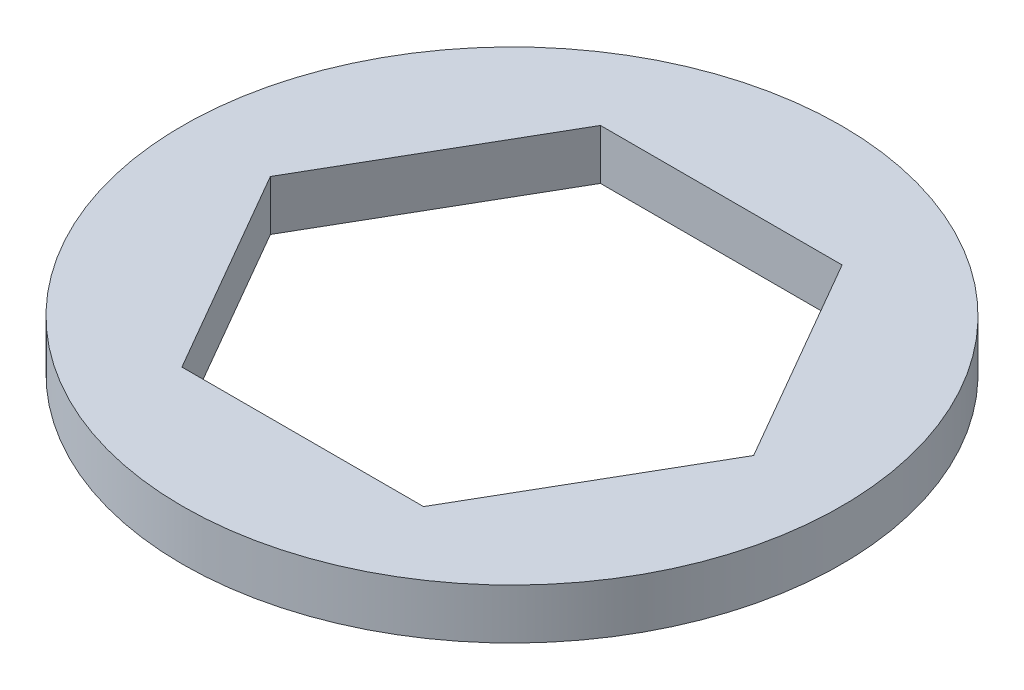
ISO-10303-21;
HEADER;
FILE_DESCRIPTION(('STEP AP214'),'2;1');
FILE_NAME('part.step','',(''),(''),'','','');
FILE_SCHEMA(('AUTOMOTIVE_DESIGN { 1 0 10303 214 1 1 1 1 }'));
ENDSEC;
DATA;
#1=APPLICATION_CONTEXT('core data for automotive mechanical design processes');
#2=APPLICATION_PROTOCOL_DEFINITION('international standard','automotive_design',2000,#1);
#3=PRODUCT_CONTEXT('',#1,'mechanical');
#4=PRODUCT('Part','Part','',(#3));
#5=PRODUCT_RELATED_PRODUCT_CATEGORY('part','',(#4));
#6=PRODUCT_DEFINITION_FORMATION('','',#4);
#7=PRODUCT_DEFINITION_CONTEXT('part definition',#1,'design');
#8=PRODUCT_DEFINITION('design','',#6,#7);
#9=PRODUCT_DEFINITION_SHAPE('','',#8);
#10=(LENGTH_UNIT() NAMED_UNIT(*) SI_UNIT(.MILLI.,.METRE.));
#11=(NAMED_UNIT(*) PLANE_ANGLE_UNIT() SI_UNIT($,.RADIAN.));
#12=(NAMED_UNIT(*) SI_UNIT($,.STERADIAN.) SOLID_ANGLE_UNIT());
#13=UNCERTAINTY_MEASURE_WITH_UNIT(LENGTH_MEASURE(1.E-05),#10,'distance_accuracy_value','');
#14=(GEOMETRIC_REPRESENTATION_CONTEXT(3) GLOBAL_UNCERTAINTY_ASSIGNED_CONTEXT((#13)) GLOBAL_UNIT_ASSIGNED_CONTEXT((#10,
#11,#12)) REPRESENTATION_CONTEXT('',''));
#15=CARTESIAN_POINT('',(0.,0.,0.));
#16=DIRECTION('',(0.,0.,1.));
#17=DIRECTION('',(1.,0.,0.));
#18=AXIS2_PLACEMENT_3D('',#15,#16,#17);
#19=CARTESIAN_POINT('',(0.,1.524,0.));
#20=DIRECTION('',(0.,1.,0.));
#21=DIRECTION('',(0.,0.,1.));
#22=AXIS2_PLACEMENT_3D('',#19,#20,#21);
#23=PLANE('',#22);
#24=CARTESIAN_POINT('',(0.,1.524,0.));
#25=DIRECTION('',(0.,1.,0.));
#26=DIRECTION('',(0.,0.,1.));
#27=AXIS2_PLACEMENT_3D('',#24,#25,#26);
#28=CIRCLE('',#27,10.);
#29=CARTESIAN_POINT('',(0.,1.524,-10.));
#30=VERTEX_POINT('',#29);
#31=EDGE_CURVE('E11',#30,#30,#28,.T.);
#32=ORIENTED_EDGE('',*,*,#31,.T.);
#33=EDGE_LOOP('',(#32));
#34=FACE_BOUND('',#33,.T.);
#35=DIRECTION('',(0.5,0.,0.866025403784439));
#36=VECTOR('',#35,1.);
#37=CARTESIAN_POINT('',(-7.33234841870825,1.524,0.));
#38=LINE('',#37,#36);
#39=CARTESIAN_POINT('',(-7.33234841870825,1.524,0.));
#40=VERTEX_POINT('',#39);
#41=CARTESIAN_POINT('',(-3.66617420935413,1.524,6.35));
#42=VERTEX_POINT('',#41);
#43=EDGE_CURVE('E93',#40,#42,#38,.T.);
#44=ORIENTED_EDGE('',*,*,#43,.F.);
#45=DIRECTION('',(-0.5,0.,0.866025403784439));
#46=VECTOR('',#45,1.);
#47=CARTESIAN_POINT('',(-3.66617420935412,1.524,-6.35));
#48=LINE('',#47,#46);
#49=CARTESIAN_POINT('',(-3.66617420935412,1.524,-6.35));
#50=VERTEX_POINT('',#49);
#51=EDGE_CURVE('E85',#50,#40,#48,.T.);
#52=ORIENTED_EDGE('',*,*,#51,.F.);
#53=DIRECTION('',(-1.,0.,0.));
#54=VECTOR('',#53,1.);
#55=CARTESIAN_POINT('',(3.66617420935412,1.524,-6.35));
#56=LINE('',#55,#54);
#57=CARTESIAN_POINT('',(3.66617420935412,1.524,-6.35));
#58=VERTEX_POINT('',#57);
#59=EDGE_CURVE('E113',#58,#50,#56,.T.);
#60=ORIENTED_EDGE('',*,*,#59,.F.);
#61=DIRECTION('',(-0.5,0.,-0.866025403784439));
#62=VECTOR('',#61,1.);
#63=CARTESIAN_POINT('',(7.33234841870825,1.524,0.));
#64=LINE('',#63,#62);
#65=CARTESIAN_POINT('',(7.33234841870825,1.524,0.));
#66=VERTEX_POINT('',#65);
#67=EDGE_CURVE('E111',#66,#58,#64,.T.);
#68=ORIENTED_EDGE('',*,*,#67,.F.);
#69=DIRECTION('',(0.5,0.,-0.866025403784439));
#70=VECTOR('',#69,1.);
#71=CARTESIAN_POINT('',(3.66617420935412,1.524,6.35));
#72=LINE('',#71,#70);
#73=CARTESIAN_POINT('',(3.66617420935412,1.524,6.35));
#74=VERTEX_POINT('',#73);
#75=EDGE_CURVE('E107',#74,#66,#72,.T.);
#76=ORIENTED_EDGE('',*,*,#75,.F.);
#77=DIRECTION('',(1.,0.,0.));
#78=VECTOR('',#77,1.);
#79=CARTESIAN_POINT('',(-3.66617420935413,1.524,6.35));
#80=LINE('',#79,#78);
#81=EDGE_CURVE('E105',#42,#74,#80,.T.);
#82=ORIENTED_EDGE('',*,*,#81,.F.);
#83=EDGE_LOOP('',(#44,#52,#60,#68,#76,#82));
#84=FACE_BOUND('',#83,.T.);
#85=ADVANCED_FACE('F32',(#34,#84),#23,.T.);
#86=CARTESIAN_POINT('',(0.,0.,0.));
#87=DIRECTION('',(0.,1.,0.));
#88=DIRECTION('',(0.,0.,1.));
#89=AXIS2_PLACEMENT_3D('',#86,#87,#88);
#90=PLANE('',#89);
#91=CARTESIAN_POINT('',(0.,0.,0.));
#92=DIRECTION('',(0.,1.,0.));
#93=DIRECTION('',(0.,0.,1.));
#94=AXIS2_PLACEMENT_3D('',#91,#92,#93);
#95=CIRCLE('',#94,10.);
#96=CARTESIAN_POINT('',(0.,0.,-10.));
#97=VERTEX_POINT('',#96);
#98=EDGE_CURVE('E36',#97,#97,#95,.T.);
#99=ORIENTED_EDGE('',*,*,#98,.F.);
#100=EDGE_LOOP('',(#99));
#101=FACE_BOUND('',#100,.T.);
#102=DIRECTION('',(-0.5,0.,0.866025403784439));
#103=VECTOR('',#102,1.);
#104=CARTESIAN_POINT('',(-3.66617420935412,0.,-6.35));
#105=LINE('',#104,#103);
#106=CARTESIAN_POINT('',(-3.66617420935412,0.,-6.35));
#107=VERTEX_POINT('',#106);
#108=CARTESIAN_POINT('',(-7.33234841870825,0.,0.));
#109=VERTEX_POINT('',#108);
#110=EDGE_CURVE('E55',#107,#109,#105,.T.);
#111=ORIENTED_EDGE('',*,*,#110,.T.);
#112=DIRECTION('',(0.5,0.,0.866025403784439));
#113=VECTOR('',#112,1.);
#114=CARTESIAN_POINT('',(-7.33234841870825,0.,0.));
#115=LINE('',#114,#113);
#116=CARTESIAN_POINT('',(-3.66617420935413,0.,6.35));
#117=VERTEX_POINT('',#116);
#118=EDGE_CURVE('E100',#109,#117,#115,.T.);
#119=ORIENTED_EDGE('',*,*,#118,.T.);
#120=DIRECTION('',(1.,0.,0.));
#121=VECTOR('',#120,1.);
#122=CARTESIAN_POINT('',(-3.66617420935413,0.,6.35));
#123=LINE('',#122,#121);
#124=CARTESIAN_POINT('',(3.66617420935412,0.,6.35));
#125=VERTEX_POINT('',#124);
#126=EDGE_CURVE('E117',#117,#125,#123,.T.);
#127=ORIENTED_EDGE('',*,*,#126,.T.);
#128=DIRECTION('',(0.5,0.,-0.866025403784439));
#129=VECTOR('',#128,1.);
#130=CARTESIAN_POINT('',(3.66617420935412,0.,6.35));
#131=LINE('',#130,#129);
#132=CARTESIAN_POINT('',(7.33234841870825,0.,0.));
#133=VERTEX_POINT('',#132);
#134=EDGE_CURVE('E120',#125,#133,#131,.T.);
#135=ORIENTED_EDGE('',*,*,#134,.T.);
#136=DIRECTION('',(-0.5,0.,-0.866025403784439));
#137=VECTOR('',#136,1.);
#138=CARTESIAN_POINT('',(7.33234841870825,0.,0.));
#139=LINE('',#138,#137);
#140=CARTESIAN_POINT('',(3.66617420935412,0.,-6.35));
#141=VERTEX_POINT('',#140);
#142=EDGE_CURVE('E123',#133,#141,#139,.T.);
#143=ORIENTED_EDGE('',*,*,#142,.T.);
#144=DIRECTION('',(-1.,0.,0.));
#145=VECTOR('',#144,1.);
#146=CARTESIAN_POINT('',(3.66617420935412,0.,-6.35));
#147=LINE('',#146,#145);
#148=EDGE_CURVE('E94',#141,#107,#147,.T.);
#149=ORIENTED_EDGE('',*,*,#148,.T.);
#150=EDGE_LOOP('',(#111,#119,#127,#135,#143,#149));
#151=FACE_BOUND('',#150,.T.);
#152=ADVANCED_FACE('F140',(#101,#151),#90,.F.);
#153=CARTESIAN_POINT('',(0.,1.524,0.));
#154=DIRECTION('',(0.,-1.,0.));
#155=DIRECTION('',(0.,0.,-1.));
#156=AXIS2_PLACEMENT_3D('',#153,#154,#155);
#157=CYLINDRICAL_SURFACE('',#156,10.);
#158=CARTESIAN_POINT('',(0.,1.524,-10.));
#159=CARTESIAN_POINT('',(0.,1.508125,-10.));
#160=CARTESIAN_POINT('',(0.,1.49225,-10.));
#161=CARTESIAN_POINT('',(0.,1.4605,-10.));
#162=CARTESIAN_POINT('',(0.,1.444625,-10.));
#163=CARTESIAN_POINT('',(0.,1.412875,-10.));
#164=CARTESIAN_POINT('',(0.,1.397,-10.));
#165=CARTESIAN_POINT('',(0.,1.36525,-10.));
#166=CARTESIAN_POINT('',(0.,1.349375,-10.));
#167=CARTESIAN_POINT('',(0.,1.317625,-10.));
#168=CARTESIAN_POINT('',(0.,1.30175,-10.));
#169=CARTESIAN_POINT('',(0.,1.27,-10.));
#170=CARTESIAN_POINT('',(0.,1.254125,-10.));
#171=CARTESIAN_POINT('',(0.,1.222375,-10.));
#172=CARTESIAN_POINT('',(0.,1.2065,-10.));
#173=CARTESIAN_POINT('',(0.,1.17475,-10.));
#174=CARTESIAN_POINT('',(0.,1.158875,-10.));
#175=CARTESIAN_POINT('',(0.,1.127125,-10.));
#176=CARTESIAN_POINT('',(0.,1.11125,-10.));
#177=CARTESIAN_POINT('',(0.,1.0795,-10.));
#178=CARTESIAN_POINT('',(0.,1.063625,-10.));
#179=CARTESIAN_POINT('',(0.,1.031875,-10.));
#180=CARTESIAN_POINT('',(0.,1.016,-10.));
#181=CARTESIAN_POINT('',(0.,0.98425,-10.));
#182=CARTESIAN_POINT('',(0.,0.968375,-10.));
#183=CARTESIAN_POINT('',(0.,0.936625,-10.));
#184=CARTESIAN_POINT('',(0.,0.92075,-10.));
#185=CARTESIAN_POINT('',(0.,0.889,-10.));
#186=CARTESIAN_POINT('',(0.,0.873125,-10.));
#187=CARTESIAN_POINT('',(0.,0.841375,-10.));
#188=CARTESIAN_POINT('',(0.,0.8255,-10.));
#189=CARTESIAN_POINT('',(0.,0.79375,-10.));
#190=CARTESIAN_POINT('',(0.,0.777875,-10.));
#191=CARTESIAN_POINT('',(0.,0.746125,-10.));
#192=CARTESIAN_POINT('',(0.,0.73025,-10.));
#193=CARTESIAN_POINT('',(0.,0.6985,-10.));
#194=CARTESIAN_POINT('',(0.,0.682625,-10.));
#195=CARTESIAN_POINT('',(0.,0.650875,-10.));
#196=CARTESIAN_POINT('',(0.,0.635,-10.));
#197=CARTESIAN_POINT('',(0.,0.60325,-10.));
#198=CARTESIAN_POINT('',(0.,0.587375,-10.));
#199=CARTESIAN_POINT('',(0.,0.555625,-10.));
#200=CARTESIAN_POINT('',(0.,0.53975,-10.));
#201=CARTESIAN_POINT('',(0.,0.508,-10.));
#202=CARTESIAN_POINT('',(0.,0.492125,-10.));
#203=CARTESIAN_POINT('',(0.,0.460375,-10.));
#204=CARTESIAN_POINT('',(0.,0.4445,-10.));
#205=CARTESIAN_POINT('',(0.,0.41275,-10.));
#206=CARTESIAN_POINT('',(0.,0.396875,-10.));
#207=CARTESIAN_POINT('',(0.,0.365125,-10.));
#208=CARTESIAN_POINT('',(0.,0.34925,-10.));
#209=CARTESIAN_POINT('',(0.,0.3175,-10.));
#210=CARTESIAN_POINT('',(0.,0.301625,-10.));
#211=CARTESIAN_POINT('',(0.,0.269875,-10.));
#212=CARTESIAN_POINT('',(0.,0.254,-10.));
#213=CARTESIAN_POINT('',(0.,0.22225,-10.));
#214=CARTESIAN_POINT('',(0.,0.206375,-10.));
#215=CARTESIAN_POINT('',(0.,0.174625,-10.));
#216=CARTESIAN_POINT('',(0.,0.15875,-10.));
#217=CARTESIAN_POINT('',(0.,0.127,-10.));
#218=CARTESIAN_POINT('',(0.,0.111125,-10.));
#219=CARTESIAN_POINT('',(0.,0.079375,-10.));
#220=CARTESIAN_POINT('',(0.,0.0635,-10.));
#221=CARTESIAN_POINT('',(0.,0.0317499999999999,-10.));
#222=CARTESIAN_POINT('',(0.,0.015875,-10.));
#223=CARTESIAN_POINT('',(0.,0.,-10.));
#224=B_SPLINE_CURVE_WITH_KNOTS('',3,(#158,#159,#160,#161,#162,#163,#164,#165,#166,#167,#168,
#169,#170,#171,#172,#173,#174,#175,#176,#177,#178,#179,#180,#181,#182,#183,#184,#185,#186,#187,
#188,#189,#190,#191,#192,#193,#194,#195,#196,#197,#198,#199,#200,#201,#202,#203,#204,#205,#206,
#207,#208,#209,#210,#211,#212,#213,#214,#215,#216,#217,#218,#219,#220,#221,#222,#223),
.UNSPECIFIED.,.F.,.F.,(4,2,2,2,2,2,2,2,2,2,2,2,2,2,2,2,2,2,2,2,2,2,2,2,2,2,2,2,2,2,2,2,4),(0.,
0.0476249999999999,0.0952499999999998,0.142875,0.1905,0.238125,0.28575,0.333375,0.381,0.428625,
0.47625,0.523875,0.5715,0.619125,0.66675,0.714375,0.762,0.809625,0.85725,0.904875,0.9525,
1.000125,1.04775,1.095375,1.143,1.190625,1.23825,1.285875,1.3335,1.381125,1.42875,1.476375,
1.524),.UNSPECIFIED.);
#225=EDGE_CURVE('BSEAM34',#30,#97,#224,.T.);
#226=ORIENTED_EDGE('',*,*,#31,.F.);
#227=ORIENTED_EDGE('',*,*,#98,.T.);
#228=ORIENTED_EDGE('',*,*,#225,.T.);
#229=ORIENTED_EDGE('',*,*,#225,.F.);
#230=EDGE_LOOP('',(#226,#228,#227,#229));
#231=FACE_BOUND('',#230,.T.);
#232=ADVANCED_FACE('F34',(#231),#157,.T.);
#233=CARTESIAN_POINT('',(-3.66617420935412,1.524,-6.35));
#234=DIRECTION('',(0.866025403784439,0.,0.5));
#235=DIRECTION('',(0.5,0.,-0.866025403784439));
#236=AXIS2_PLACEMENT_3D('',#233,#234,#235);
#237=PLANE('',#236);
#238=ORIENTED_EDGE('',*,*,#110,.F.);
#239=DIRECTION('',(0.,-1.,0.));
#240=VECTOR('',#239,1.);
#241=CARTESIAN_POINT('',(-3.66617420935412,1.524,-6.35));
#242=LINE('',#241,#240);
#243=EDGE_CURVE('E89',#50,#107,#242,.T.);
#244=ORIENTED_EDGE('',*,*,#243,.F.);
#245=ORIENTED_EDGE('',*,*,#51,.T.);
#246=DIRECTION('',(0.,-1.,0.));
#247=VECTOR('',#246,1.);
#248=CARTESIAN_POINT('',(-7.33234841870825,1.524,0.));
#249=LINE('',#248,#247);
#250=EDGE_CURVE('E88',#40,#109,#249,.T.);
#251=ORIENTED_EDGE('',*,*,#250,.T.);
#252=EDGE_LOOP('',(#238,#244,#245,#251));
#253=FACE_BOUND('',#252,.T.);
#254=ADVANCED_FACE('F87',(#253),#237,.T.);
#255=CARTESIAN_POINT('',(-7.33234841870825,1.524,0.));
#256=DIRECTION('',(0.866025403784439,0.,-0.5));
#257=DIRECTION('',(-0.5,0.,-0.866025403784439));
#258=AXIS2_PLACEMENT_3D('',#255,#256,#257);
#259=PLANE('',#258);
#260=ORIENTED_EDGE('',*,*,#118,.F.);
#261=ORIENTED_EDGE('',*,*,#250,.F.);
#262=ORIENTED_EDGE('',*,*,#43,.T.);
#263=DIRECTION('',(0.,-1.,0.));
#264=VECTOR('',#263,1.);
#265=CARTESIAN_POINT('',(-3.66617420935413,1.524,6.35));
#266=LINE('',#265,#264);
#267=EDGE_CURVE('E101',#42,#117,#266,.T.);
#268=ORIENTED_EDGE('',*,*,#267,.T.);
#269=EDGE_LOOP('',(#260,#261,#262,#268));
#270=FACE_BOUND('',#269,.T.);
#271=ADVANCED_FACE('F97',(#270),#259,.T.);
#272=CARTESIAN_POINT('',(-3.66617420935413,1.524,6.35));
#273=DIRECTION('',(0.,0.,-1.));
#274=DIRECTION('',(-1.,0.,0.));
#275=AXIS2_PLACEMENT_3D('',#272,#273,#274);
#276=PLANE('',#275);
#277=ORIENTED_EDGE('',*,*,#126,.F.);
#278=ORIENTED_EDGE('',*,*,#267,.F.);
#279=ORIENTED_EDGE('',*,*,#81,.T.);
#280=DIRECTION('',(0.,-1.,0.));
#281=VECTOR('',#280,1.);
#282=CARTESIAN_POINT('',(3.66617420935412,1.524,6.35));
#283=LINE('',#282,#281);
#284=EDGE_CURVE('E132',#74,#125,#283,.T.);
#285=ORIENTED_EDGE('',*,*,#284,.T.);
#286=EDGE_LOOP('',(#277,#278,#279,#285));
#287=FACE_BOUND('',#286,.T.);
#288=ADVANCED_FACE('F136',(#287),#276,.T.);
#289=CARTESIAN_POINT('',(3.66617420935412,1.524,6.35));
#290=DIRECTION('',(-0.866025403784439,0.,-0.5));
#291=DIRECTION('',(-0.5,0.,0.866025403784439));
#292=AXIS2_PLACEMENT_3D('',#289,#290,#291);
#293=PLANE('',#292);
#294=ORIENTED_EDGE('',*,*,#134,.F.);
#295=ORIENTED_EDGE('',*,*,#284,.F.);
#296=ORIENTED_EDGE('',*,*,#75,.T.);
#297=DIRECTION('',(0.,-1.,0.));
#298=VECTOR('',#297,1.);
#299=CARTESIAN_POINT('',(7.33234841870825,1.524,0.));
#300=LINE('',#299,#298);
#301=EDGE_CURVE('E130',#66,#133,#300,.T.);
#302=ORIENTED_EDGE('',*,*,#301,.T.);
#303=EDGE_LOOP('',(#294,#295,#296,#302));
#304=FACE_BOUND('',#303,.T.);
#305=ADVANCED_FACE('F148',(#304),#293,.T.);
#306=CARTESIAN_POINT('',(7.33234841870825,1.524,0.));
#307=DIRECTION('',(-0.866025403784439,0.,0.5));
#308=DIRECTION('',(0.5,0.,0.866025403784439));
#309=AXIS2_PLACEMENT_3D('',#306,#307,#308);
#310=PLANE('',#309);
#311=ORIENTED_EDGE('',*,*,#142,.F.);
#312=ORIENTED_EDGE('',*,*,#301,.F.);
#313=ORIENTED_EDGE('',*,*,#67,.T.);
#314=DIRECTION('',(0.,-1.,0.));
#315=VECTOR('',#314,1.);
#316=CARTESIAN_POINT('',(3.66617420935412,1.524,-6.35));
#317=LINE('',#316,#315);
#318=EDGE_CURVE('E47',#58,#141,#317,.T.);
#319=ORIENTED_EDGE('',*,*,#318,.T.);
#320=EDGE_LOOP('',(#311,#312,#313,#319));
#321=FACE_BOUND('',#320,.T.);
#322=ADVANCED_FACE('F146',(#321),#310,.T.);
#323=CARTESIAN_POINT('',(3.66617420935412,1.524,-6.35));
#324=DIRECTION('',(0.,0.,1.));
#325=DIRECTION('',(1.,0.,0.));
#326=AXIS2_PLACEMENT_3D('',#323,#324,#325);
#327=PLANE('',#326);
#328=ORIENTED_EDGE('',*,*,#148,.F.);
#329=ORIENTED_EDGE('',*,*,#318,.F.);
#330=ORIENTED_EDGE('',*,*,#59,.T.);
#331=ORIENTED_EDGE('',*,*,#243,.T.);
#332=EDGE_LOOP('',(#328,#329,#330,#331));
#333=FACE_BOUND('',#332,.T.);
#334=ADVANCED_FACE('F142',(#333),#327,.T.);
#335=CLOSED_SHELL('',(#85,#152,#232,#254,#271,#288,#305,#322,#334));
#336=MANIFOLD_SOLID_BREP('B2',#335);
#337=ADVANCED_BREP_SHAPE_REPRESENTATION('',(#18,#336),#14);
#338=SHAPE_DEFINITION_REPRESENTATION(#9,#337);
ENDSEC;
END-ISO-10303-21;
